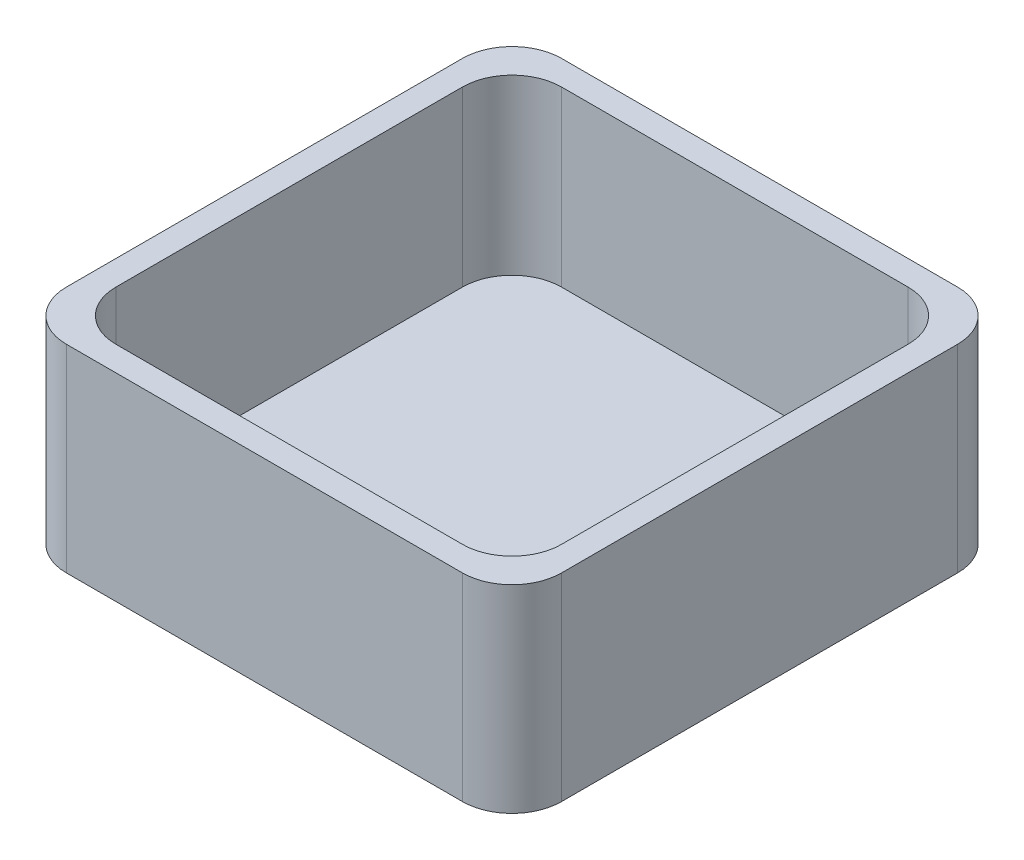
ISO-10303-21;
HEADER;
FILE_DESCRIPTION(('STEP AP214'),'2;1');
FILE_NAME('part.step','',(''),(''),'','','');
FILE_SCHEMA(('AUTOMOTIVE_DESIGN { 1 0 10303 214 1 1 1 1 }'));
ENDSEC;
DATA;
#1=APPLICATION_CONTEXT('core data for automotive mechanical design processes');
#2=APPLICATION_PROTOCOL_DEFINITION('international standard','automotive_design',2000,#1);
#3=PRODUCT_CONTEXT('',#1,'mechanical');
#4=PRODUCT('Part','Part','',(#3));
#5=PRODUCT_RELATED_PRODUCT_CATEGORY('part','',(#4));
#6=PRODUCT_DEFINITION_FORMATION('','',#4);
#7=PRODUCT_DEFINITION_CONTEXT('part definition',#1,'design');
#8=PRODUCT_DEFINITION('design','',#6,#7);
#9=PRODUCT_DEFINITION_SHAPE('','',#8);
#10=(LENGTH_UNIT() NAMED_UNIT(*) SI_UNIT(.MILLI.,.METRE.));
#11=(NAMED_UNIT(*) PLANE_ANGLE_UNIT() SI_UNIT($,.RADIAN.));
#12=(NAMED_UNIT(*) SI_UNIT($,.STERADIAN.) SOLID_ANGLE_UNIT());
#13=UNCERTAINTY_MEASURE_WITH_UNIT(LENGTH_MEASURE(1.E-05),#10,'distance_accuracy_value','');
#14=(GEOMETRIC_REPRESENTATION_CONTEXT(3) GLOBAL_UNCERTAINTY_ASSIGNED_CONTEXT((#13)) GLOBAL_UNIT_ASSIGNED_CONTEXT((#10,
#11,#12)) REPRESENTATION_CONTEXT('',''));
#15=CARTESIAN_POINT('',(0.,0.,0.));
#16=DIRECTION('',(0.,0.,1.));
#17=DIRECTION('',(1.,0.,0.));
#18=AXIS2_PLACEMENT_3D('',#15,#16,#17);
#19=CARTESIAN_POINT('',(0.,40.,0.));
#20=DIRECTION('',(1.,0.,0.));
#21=DIRECTION('',(0.,0.,-1.));
#22=AXIS2_PLACEMENT_3D('',#19,#20,#21);
#23=PLANE('',#22);
#24=DIRECTION('',(0.,0.,1.));
#25=VECTOR('',#24,1.);
#26=CARTESIAN_POINT('',(0.,0.,0.));
#27=LINE('',#26,#25);
#28=CARTESIAN_POINT('',(0.,0.,10.));
#29=VERTEX_POINT('',#28);
#30=CARTESIAN_POINT('',(0.,0.,90.));
#31=VERTEX_POINT('',#30);
#32=EDGE_CURVE('E210',#29,#31,#27,.T.);
#33=ORIENTED_EDGE('',*,*,#32,.T.);
#34=DIRECTION('',(0.,-1.,0.));
#35=VECTOR('',#34,1.);
#36=CARTESIAN_POINT('',(0.,40.,90.));
#37=LINE('',#36,#35);
#38=CARTESIAN_POINT('',(0.,40.,90.));
#39=VERTEX_POINT('',#38);
#40=EDGE_CURVE('E166',#31,#39,#37,.F.);
#41=ORIENTED_EDGE('',*,*,#40,.T.);
#42=DIRECTION('',(0.,0.,1.));
#43=VECTOR('',#42,1.);
#44=CARTESIAN_POINT('',(0.,40.,0.));
#45=LINE('',#44,#43);
#46=CARTESIAN_POINT('',(0.,40.,10.));
#47=VERTEX_POINT('',#46);
#48=EDGE_CURVE('E195',#47,#39,#45,.T.);
#49=ORIENTED_EDGE('',*,*,#48,.F.);
#50=DIRECTION('',(0.,-1.,0.));
#51=VECTOR('',#50,1.);
#52=CARTESIAN_POINT('',(0.,40.,10.));
#53=LINE('',#52,#51);
#54=EDGE_CURVE('E300',#47,#29,#53,.T.);
#55=ORIENTED_EDGE('',*,*,#54,.T.);
#56=EDGE_LOOP('',(#33,#41,#49,#55));
#57=FACE_BOUND('',#56,.T.);
#58=ADVANCED_FACE('F39',(#57),#23,.F.);
#59=CARTESIAN_POINT('',(0.,40.,100.));
#60=DIRECTION('',(0.,0.,-1.));
#61=DIRECTION('',(-1.,0.,0.));
#62=AXIS2_PLACEMENT_3D('',#59,#60,#61);
#63=PLANE('',#62);
#64=DIRECTION('',(1.,0.,0.));
#65=VECTOR('',#64,1.);
#66=CARTESIAN_POINT('',(0.,0.,100.));
#67=LINE('',#66,#65);
#68=CARTESIAN_POINT('',(10.,0.,100.));
#69=VERTEX_POINT('',#68);
#70=CARTESIAN_POINT('',(90.,0.,100.));
#71=VERTEX_POINT('',#70);
#72=EDGE_CURVE('E214',#69,#71,#67,.T.);
#73=ORIENTED_EDGE('',*,*,#72,.T.);
#74=DIRECTION('',(0.,-1.,0.));
#75=VECTOR('',#74,1.);
#76=CARTESIAN_POINT('',(90.,40.,100.));
#77=LINE('',#76,#75);
#78=CARTESIAN_POINT('',(90.,40.,100.));
#79=VERTEX_POINT('',#78);
#80=EDGE_CURVE('E55',#71,#79,#77,.F.);
#81=ORIENTED_EDGE('',*,*,#80,.T.);
#82=DIRECTION('',(1.,0.,0.));
#83=VECTOR('',#82,1.);
#84=CARTESIAN_POINT('',(0.,40.,100.));
#85=LINE('',#84,#83);
#86=CARTESIAN_POINT('',(10.,40.,100.));
#87=VERTEX_POINT('',#86);
#88=EDGE_CURVE('E198',#87,#79,#85,.T.);
#89=ORIENTED_EDGE('',*,*,#88,.F.);
#90=DIRECTION('',(0.,-1.,0.));
#91=VECTOR('',#90,1.);
#92=CARTESIAN_POINT('',(10.,40.,100.));
#93=LINE('',#92,#91);
#94=EDGE_CURVE('E280',#87,#69,#93,.T.);
#95=ORIENTED_EDGE('',*,*,#94,.T.);
#96=EDGE_LOOP('',(#73,#81,#89,#95));
#97=FACE_BOUND('',#96,.T.);
#98=ADVANCED_FACE('F355',(#97),#63,.F.);
#99=CARTESIAN_POINT('',(100.,40.,0.));
#100=DIRECTION('',(-1.,0.,0.));
#101=DIRECTION('',(0.,0.,1.));
#102=AXIS2_PLACEMENT_3D('',#99,#100,#101);
#103=PLANE('',#102);
#104=DIRECTION('',(0.,0.,-1.));
#105=VECTOR('',#104,1.);
#106=CARTESIAN_POINT('',(100.,0.,0.));
#107=LINE('',#106,#105);
#108=CARTESIAN_POINT('',(100.,0.,90.));
#109=VERTEX_POINT('',#108);
#110=CARTESIAN_POINT('',(100.,0.,10.));
#111=VERTEX_POINT('',#110);
#112=EDGE_CURVE('E217',#109,#111,#107,.T.);
#113=ORIENTED_EDGE('',*,*,#112,.T.);
#114=DIRECTION('',(0.,-1.,0.));
#115=VECTOR('',#114,1.);
#116=CARTESIAN_POINT('',(100.,40.,10.));
#117=LINE('',#116,#115);
#118=CARTESIAN_POINT('',(100.,40.,10.));
#119=VERTEX_POINT('',#118);
#120=EDGE_CURVE('E266',#111,#119,#117,.F.);
#121=ORIENTED_EDGE('',*,*,#120,.T.);
#122=DIRECTION('',(0.,0.,-1.));
#123=VECTOR('',#122,1.);
#124=CARTESIAN_POINT('',(100.,40.,0.));
#125=LINE('',#124,#123);
#126=CARTESIAN_POINT('',(100.,40.,90.));
#127=VERTEX_POINT('',#126);
#128=EDGE_CURVE('E202',#127,#119,#125,.T.);
#129=ORIENTED_EDGE('',*,*,#128,.F.);
#130=DIRECTION('',(0.,-1.,0.));
#131=VECTOR('',#130,1.);
#132=CARTESIAN_POINT('',(100.,40.,90.));
#133=LINE('',#132,#131);
#134=EDGE_CURVE('E262',#127,#109,#133,.T.);
#135=ORIENTED_EDGE('',*,*,#134,.T.);
#136=EDGE_LOOP('',(#113,#121,#129,#135));
#137=FACE_BOUND('',#136,.T.);
#138=ADVANCED_FACE('F361',(#137),#103,.F.);
#139=CARTESIAN_POINT('',(0.,40.,0.));
#140=DIRECTION('',(0.,0.,1.));
#141=DIRECTION('',(1.,0.,0.));
#142=AXIS2_PLACEMENT_3D('',#139,#140,#141);
#143=PLANE('',#142);
#144=DIRECTION('',(-1.,0.,0.));
#145=VECTOR('',#144,1.);
#146=CARTESIAN_POINT('',(0.,40.,0.));
#147=LINE('',#146,#145);
#148=CARTESIAN_POINT('',(90.,40.,0.));
#149=VERTEX_POINT('',#148);
#150=CARTESIAN_POINT('',(10.,40.,0.));
#151=VERTEX_POINT('',#150);
#152=EDGE_CURVE('E206',#149,#151,#147,.T.);
#153=ORIENTED_EDGE('',*,*,#152,.F.);
#154=DIRECTION('',(0.,-1.,0.));
#155=VECTOR('',#154,1.);
#156=CARTESIAN_POINT('',(90.,40.,0.));
#157=LINE('',#156,#155);
#158=CARTESIAN_POINT('',(90.,0.,0.));
#159=VERTEX_POINT('',#158);
#160=EDGE_CURVE('E246',#149,#159,#157,.T.);
#161=ORIENTED_EDGE('',*,*,#160,.T.);
#162=DIRECTION('',(-1.,0.,0.));
#163=VECTOR('',#162,1.);
#164=CARTESIAN_POINT('',(0.,0.,0.));
#165=LINE('',#164,#163);
#166=CARTESIAN_POINT('',(10.,0.,0.));
#167=VERTEX_POINT('',#166);
#168=EDGE_CURVE('E199',#159,#167,#165,.T.);
#169=ORIENTED_EDGE('',*,*,#168,.T.);
#170=DIRECTION('',(0.,-1.,0.));
#171=VECTOR('',#170,1.);
#172=CARTESIAN_POINT('',(10.,40.,0.));
#173=LINE('',#172,#171);
#174=EDGE_CURVE('E243',#167,#151,#173,.F.);
#175=ORIENTED_EDGE('',*,*,#174,.T.);
#176=EDGE_LOOP('',(#153,#161,#169,#175));
#177=FACE_BOUND('',#176,.T.);
#178=ADVANCED_FACE('F413',(#177),#143,.F.);
#179=CARTESIAN_POINT('',(0.,40.,0.));
#180=DIRECTION('',(0.,1.,0.));
#181=DIRECTION('',(0.,0.,1.));
#182=AXIS2_PLACEMENT_3D('',#179,#180,#181);
#183=PLANE('',#182);
#184=DIRECTION('',(0.,0.,1.));
#185=VECTOR('',#184,1.);
#186=CARTESIAN_POINT('',(5.,40.,5.));
#187=LINE('',#186,#185);
#188=CARTESIAN_POINT('',(5.,40.,15.));
#189=VERTEX_POINT('',#188);
#190=CARTESIAN_POINT('',(5.00000000000001,40.,85.));
#191=VERTEX_POINT('',#190);
#192=EDGE_CURVE('E310',#189,#191,#187,.T.);
#193=ORIENTED_EDGE('',*,*,#192,.F.);
#194=CARTESIAN_POINT('',(15.,40.,15.));
#195=DIRECTION('',(0.,1.,0.));
#196=DIRECTION('',(0.,0.,1.));
#197=AXIS2_PLACEMENT_3D('',#194,#195,#196);
#198=CIRCLE('',#197,10.);
#199=CARTESIAN_POINT('',(15.,40.,5.));
#200=VERTEX_POINT('',#199);
#201=EDGE_CURVE('E11',#189,#200,#198,.F.);
#202=ORIENTED_EDGE('',*,*,#201,.T.);
#203=DIRECTION('',(-1.,0.,0.));
#204=VECTOR('',#203,1.);
#205=CARTESIAN_POINT('',(5.,40.,5.));
#206=LINE('',#205,#204);
#207=CARTESIAN_POINT('',(85.,40.,5.));
#208=VERTEX_POINT('',#207);
#209=EDGE_CURVE('E172',#208,#200,#206,.T.);
#210=ORIENTED_EDGE('',*,*,#209,.F.);
#211=CARTESIAN_POINT('',(85.,40.,15.));
#212=DIRECTION('',(0.,1.,0.));
#213=DIRECTION('',(0.,0.,1.));
#214=AXIS2_PLACEMENT_3D('',#211,#212,#213);
#215=CIRCLE('',#214,10.);
#216=CARTESIAN_POINT('',(95.,40.,15.));
#217=VERTEX_POINT('',#216);
#218=EDGE_CURVE('E154',#208,#217,#215,.F.);
#219=ORIENTED_EDGE('',*,*,#218,.T.);
#220=DIRECTION('',(0.,0.,-1.));
#221=VECTOR('',#220,1.);
#222=CARTESIAN_POINT('',(95.,40.,5.));
#223=LINE('',#222,#221);
#224=CARTESIAN_POINT('',(95.,40.,85.));
#225=VERTEX_POINT('',#224);
#226=EDGE_CURVE('E184',#225,#217,#223,.T.);
#227=ORIENTED_EDGE('',*,*,#226,.F.);
#228=CARTESIAN_POINT('',(85.,40.,85.));
#229=DIRECTION('',(0.,1.,0.));
#230=DIRECTION('',(0.,0.,1.));
#231=AXIS2_PLACEMENT_3D('',#228,#229,#230);
#232=CIRCLE('',#231,10.);
#233=CARTESIAN_POINT('',(85.,40.,95.));
#234=VERTEX_POINT('',#233);
#235=EDGE_CURVE('E165',#225,#234,#232,.F.);
#236=ORIENTED_EDGE('',*,*,#235,.T.);
#237=DIRECTION('',(1.,0.,0.));
#238=VECTOR('',#237,1.);
#239=CARTESIAN_POINT('',(5.00000000000001,40.,95.));
#240=LINE('',#239,#238);
#241=CARTESIAN_POINT('',(15.,40.,95.));
#242=VERTEX_POINT('',#241);
#243=EDGE_CURVE('E191',#242,#234,#240,.T.);
#244=ORIENTED_EDGE('',*,*,#243,.F.);
#245=CARTESIAN_POINT('',(15.,40.,85.));
#246=DIRECTION('',(0.,1.,0.));
#247=DIRECTION('',(0.,0.,1.));
#248=AXIS2_PLACEMENT_3D('',#245,#246,#247);
#249=CIRCLE('',#248,10.);
#250=EDGE_CURVE('E48',#242,#191,#249,.F.);
#251=ORIENTED_EDGE('',*,*,#250,.T.);
#252=EDGE_LOOP('',(#193,#202,#210,#219,#227,#236,#244,#251));
#253=FACE_BOUND('',#252,.T.);
#254=ORIENTED_EDGE('',*,*,#128,.T.);
#255=CARTESIAN_POINT('',(90.,40.,10.));
#256=DIRECTION('',(0.,1.,0.));
#257=DIRECTION('',(0.,0.,1.));
#258=AXIS2_PLACEMENT_3D('',#255,#256,#257);
#259=CIRCLE('',#258,10.);
#260=EDGE_CURVE('E277',#119,#149,#259,.T.);
#261=ORIENTED_EDGE('',*,*,#260,.T.);
#262=ORIENTED_EDGE('',*,*,#152,.T.);
#263=CARTESIAN_POINT('',(10.,40.,10.));
#264=DIRECTION('',(0.,1.,0.));
#265=DIRECTION('',(0.,0.,1.));
#266=AXIS2_PLACEMENT_3D('',#263,#264,#265);
#267=CIRCLE('',#266,10.);
#268=EDGE_CURVE('E269',#151,#47,#267,.T.);
#269=ORIENTED_EDGE('',*,*,#268,.T.);
#270=ORIENTED_EDGE('',*,*,#48,.T.);
#271=CARTESIAN_POINT('',(10.,40.,90.));
#272=DIRECTION('',(0.,1.,0.));
#273=DIRECTION('',(0.,0.,1.));
#274=AXIS2_PLACEMENT_3D('',#271,#272,#273);
#275=CIRCLE('',#274,10.);
#276=EDGE_CURVE('E62',#39,#87,#275,.T.);
#277=ORIENTED_EDGE('',*,*,#276,.T.);
#278=ORIENTED_EDGE('',*,*,#88,.T.);
#279=CARTESIAN_POINT('',(90.,40.,90.));
#280=DIRECTION('',(0.,1.,0.));
#281=DIRECTION('',(0.,0.,1.));
#282=AXIS2_PLACEMENT_3D('',#279,#280,#281);
#283=CIRCLE('',#282,10.);
#284=EDGE_CURVE('E274',#79,#127,#283,.T.);
#285=ORIENTED_EDGE('',*,*,#284,.T.);
#286=EDGE_LOOP('',(#254,#261,#262,#269,#270,#277,#278,#285));
#287=FACE_BOUND('',#286,.T.);
#288=ADVANCED_FACE('F181',(#253,#287),#183,.T.);
#289=CARTESIAN_POINT('',(0.,0.,0.));
#290=DIRECTION('',(0.,1.,0.));
#291=DIRECTION('',(0.,0.,1.));
#292=AXIS2_PLACEMENT_3D('',#289,#290,#291);
#293=PLANE('',#292);
#294=ORIENTED_EDGE('',*,*,#168,.F.);
#295=CARTESIAN_POINT('',(90.,0.,10.));
#296=DIRECTION('',(0.,1.,0.));
#297=DIRECTION('',(0.,0.,1.));
#298=AXIS2_PLACEMENT_3D('',#295,#296,#297);
#299=CIRCLE('',#298,10.);
#300=EDGE_CURVE('E259',#159,#111,#299,.F.);
#301=ORIENTED_EDGE('',*,*,#300,.T.);
#302=ORIENTED_EDGE('',*,*,#112,.F.);
#303=CARTESIAN_POINT('',(90.,0.,90.));
#304=DIRECTION('',(0.,1.,0.));
#305=DIRECTION('',(0.,0.,1.));
#306=AXIS2_PLACEMENT_3D('',#303,#304,#305);
#307=CIRCLE('',#306,10.);
#308=EDGE_CURVE('E256',#109,#71,#307,.F.);
#309=ORIENTED_EDGE('',*,*,#308,.T.);
#310=ORIENTED_EDGE('',*,*,#72,.F.);
#311=CARTESIAN_POINT('',(10.,0.,90.));
#312=DIRECTION('',(0.,1.,0.));
#313=DIRECTION('',(0.,0.,1.));
#314=AXIS2_PLACEMENT_3D('',#311,#312,#313);
#315=CIRCLE('',#314,10.);
#316=EDGE_CURVE('E253',#69,#31,#315,.F.);
#317=ORIENTED_EDGE('',*,*,#316,.T.);
#318=ORIENTED_EDGE('',*,*,#32,.F.);
#319=CARTESIAN_POINT('',(10.,0.,10.));
#320=DIRECTION('',(0.,1.,0.));
#321=DIRECTION('',(0.,0.,1.));
#322=AXIS2_PLACEMENT_3D('',#319,#320,#321);
#323=CIRCLE('',#322,10.);
#324=EDGE_CURVE('E250',#29,#167,#323,.F.);
#325=ORIENTED_EDGE('',*,*,#324,.T.);
#326=EDGE_LOOP('',(#294,#301,#302,#309,#310,#317,#318,#325));
#327=FACE_BOUND('',#326,.T.);
#328=ADVANCED_FACE('F403',(#327),#293,.F.);
#329=CARTESIAN_POINT('',(5.,5.,5.));
#330=DIRECTION('',(-1.,0.,0.));
#331=DIRECTION('',(0.,0.,1.));
#332=AXIS2_PLACEMENT_3D('',#329,#330,#331);
#333=PLANE('',#332);
#334=ORIENTED_EDGE('',*,*,#192,.T.);
#335=DIRECTION('',(0.,1.,0.));
#336=VECTOR('',#335,1.);
#337=CARTESIAN_POINT('',(5.00000000000001,5.,85.));
#338=LINE('',#337,#336);
#339=CARTESIAN_POINT('',(5.00000000000001,5.,85.));
#340=VERTEX_POINT('',#339);
#341=EDGE_CURVE('E297',#191,#340,#338,.F.);
#342=ORIENTED_EDGE('',*,*,#341,.T.);
#343=DIRECTION('',(0.,0.,1.));
#344=VECTOR('',#343,1.);
#345=CARTESIAN_POINT('',(5.,5.,5.));
#346=LINE('',#345,#344);
#347=CARTESIAN_POINT('',(5.,5.,15.));
#348=VERTEX_POINT('',#347);
#349=EDGE_CURVE('E183',#348,#340,#346,.T.);
#350=ORIENTED_EDGE('',*,*,#349,.F.);
#351=DIRECTION('',(0.,1.,0.));
#352=VECTOR('',#351,1.);
#353=CARTESIAN_POINT('',(5.,40.,15.));
#354=LINE('',#353,#352);
#355=EDGE_CURVE('E293',#348,#189,#354,.T.);
#356=ORIENTED_EDGE('',*,*,#355,.T.);
#357=EDGE_LOOP('',(#334,#342,#350,#356));
#358=FACE_BOUND('',#357,.T.);
#359=ADVANCED_FACE('F316',(#358),#333,.F.);
#360=CARTESIAN_POINT('',(5.,5.,5.));
#361=DIRECTION('',(0.,0.,-1.));
#362=DIRECTION('',(-1.,0.,0.));
#363=AXIS2_PLACEMENT_3D('',#360,#361,#362);
#364=PLANE('',#363);
#365=DIRECTION('',(-1.,0.,0.));
#366=VECTOR('',#365,1.);
#367=CARTESIAN_POINT('',(5.,5.,5.));
#368=LINE('',#367,#366);
#369=CARTESIAN_POINT('',(85.,5.,5.));
#370=VERTEX_POINT('',#369);
#371=CARTESIAN_POINT('',(15.,5.,5.));
#372=VERTEX_POINT('',#371);
#373=EDGE_CURVE('E175',#370,#372,#368,.T.);
#374=ORIENTED_EDGE('',*,*,#373,.F.);
#375=DIRECTION('',(0.,1.,0.));
#376=VECTOR('',#375,1.);
#377=CARTESIAN_POINT('',(85.,40.,5.));
#378=LINE('',#377,#376);
#379=EDGE_CURVE('E158',#370,#208,#378,.T.);
#380=ORIENTED_EDGE('',*,*,#379,.T.);
#381=ORIENTED_EDGE('',*,*,#209,.T.);
#382=DIRECTION('',(0.,1.,0.));
#383=VECTOR('',#382,1.);
#384=CARTESIAN_POINT('',(15.,5.,5.));
#385=LINE('',#384,#383);
#386=EDGE_CURVE('E178',#200,#372,#385,.F.);
#387=ORIENTED_EDGE('',*,*,#386,.T.);
#388=EDGE_LOOP('',(#374,#380,#381,#387));
#389=FACE_BOUND('',#388,.T.);
#390=ADVANCED_FACE('F171',(#389),#364,.F.);
#391=CARTESIAN_POINT('',(95.,5.,5.));
#392=DIRECTION('',(1.,0.,0.));
#393=DIRECTION('',(0.,0.,-1.));
#394=AXIS2_PLACEMENT_3D('',#391,#392,#393);
#395=PLANE('',#394);
#396=ORIENTED_EDGE('',*,*,#226,.T.);
#397=DIRECTION('',(0.,1.,0.));
#398=VECTOR('',#397,1.);
#399=CARTESIAN_POINT('',(95.,5.,15.));
#400=LINE('',#399,#398);
#401=CARTESIAN_POINT('',(95.,5.,15.));
#402=VERTEX_POINT('',#401);
#403=EDGE_CURVE('E159',#217,#402,#400,.F.);
#404=ORIENTED_EDGE('',*,*,#403,.T.);
#405=DIRECTION('',(0.,0.,-1.));
#406=VECTOR('',#405,1.);
#407=CARTESIAN_POINT('',(95.,5.,5.));
#408=LINE('',#407,#406);
#409=CARTESIAN_POINT('',(95.,5.,85.));
#410=VERTEX_POINT('',#409);
#411=EDGE_CURVE('E333',#410,#402,#408,.T.);
#412=ORIENTED_EDGE('',*,*,#411,.F.);
#413=DIRECTION('',(0.,1.,0.));
#414=VECTOR('',#413,1.);
#415=CARTESIAN_POINT('',(95.,40.,85.));
#416=LINE('',#415,#414);
#417=EDGE_CURVE('E177',#410,#225,#416,.T.);
#418=ORIENTED_EDGE('',*,*,#417,.T.);
#419=EDGE_LOOP('',(#396,#404,#412,#418));
#420=FACE_BOUND('',#419,.T.);
#421=ADVANCED_FACE('F345',(#420),#395,.F.);
#422=CARTESIAN_POINT('',(5.00000000000001,5.,95.));
#423=DIRECTION('',(0.,0.,1.));
#424=DIRECTION('',(1.,0.,0.));
#425=AXIS2_PLACEMENT_3D('',#422,#423,#424);
#426=PLANE('',#425);
#427=ORIENTED_EDGE('',*,*,#243,.T.);
#428=DIRECTION('',(0.,1.,0.));
#429=VECTOR('',#428,1.);
#430=CARTESIAN_POINT('',(85.,5.,95.));
#431=LINE('',#430,#429);
#432=CARTESIAN_POINT('',(85.,5.,95.));
#433=VERTEX_POINT('',#432);
#434=EDGE_CURVE('E290',#234,#433,#431,.F.);
#435=ORIENTED_EDGE('',*,*,#434,.T.);
#436=DIRECTION('',(1.,0.,0.));
#437=VECTOR('',#436,1.);
#438=CARTESIAN_POINT('',(5.00000000000001,5.,95.));
#439=LINE('',#438,#437);
#440=CARTESIAN_POINT('',(15.,5.,95.));
#441=VERTEX_POINT('',#440);
#442=EDGE_CURVE('E189',#441,#433,#439,.T.);
#443=ORIENTED_EDGE('',*,*,#442,.F.);
#444=DIRECTION('',(0.,1.,0.));
#445=VECTOR('',#444,1.);
#446=CARTESIAN_POINT('',(15.,40.,95.));
#447=LINE('',#446,#445);
#448=EDGE_CURVE('E286',#441,#242,#447,.T.);
#449=ORIENTED_EDGE('',*,*,#448,.T.);
#450=EDGE_LOOP('',(#427,#435,#443,#449));
#451=FACE_BOUND('',#450,.T.);
#452=ADVANCED_FACE('F330',(#451),#426,.F.);
#453=CARTESIAN_POINT('',(0.,5.,0.));
#454=DIRECTION('',(0.,1.,0.));
#455=DIRECTION('',(0.,0.,1.));
#456=AXIS2_PLACEMENT_3D('',#453,#454,#455);
#457=PLANE('',#456);
#458=ORIENTED_EDGE('',*,*,#411,.T.);
#459=CARTESIAN_POINT('',(85.,5.,15.));
#460=DIRECTION('',(0.,1.,0.));
#461=DIRECTION('',(0.,0.,1.));
#462=AXIS2_PLACEMENT_3D('',#459,#460,#461);
#463=CIRCLE('',#462,10.);
#464=EDGE_CURVE('E240',#402,#370,#463,.T.);
#465=ORIENTED_EDGE('',*,*,#464,.T.);
#466=ORIENTED_EDGE('',*,*,#373,.T.);
#467=CARTESIAN_POINT('',(15.,5.,15.));
#468=DIRECTION('',(0.,1.,0.));
#469=DIRECTION('',(0.,0.,1.));
#470=AXIS2_PLACEMENT_3D('',#467,#468,#469);
#471=CIRCLE('',#470,10.);
#472=EDGE_CURVE('E231',#372,#348,#471,.T.);
#473=ORIENTED_EDGE('',*,*,#472,.T.);
#474=ORIENTED_EDGE('',*,*,#349,.T.);
#475=CARTESIAN_POINT('',(15.,5.,85.));
#476=DIRECTION('',(0.,1.,0.));
#477=DIRECTION('',(0.,0.,1.));
#478=AXIS2_PLACEMENT_3D('',#475,#476,#477);
#479=CIRCLE('',#478,10.);
#480=EDGE_CURVE('E234',#340,#441,#479,.T.);
#481=ORIENTED_EDGE('',*,*,#480,.T.);
#482=ORIENTED_EDGE('',*,*,#442,.T.);
#483=CARTESIAN_POINT('',(85.,5.,85.));
#484=DIRECTION('',(0.,1.,0.));
#485=DIRECTION('',(0.,0.,1.));
#486=AXIS2_PLACEMENT_3D('',#483,#484,#485);
#487=CIRCLE('',#486,10.);
#488=EDGE_CURVE('E237',#433,#410,#487,.T.);
#489=ORIENTED_EDGE('',*,*,#488,.T.);
#490=EDGE_LOOP('',(#458,#465,#466,#473,#474,#481,#482,#489));
#491=FACE_BOUND('',#490,.T.);
#492=ADVANCED_FACE('F327',(#491),#457,.T.);
#493=CARTESIAN_POINT('',(85.,5.,15.));
#494=DIRECTION('',(0.,-1.,0.));
#495=DIRECTION('',(0.,0.,-1.));
#496=AXIS2_PLACEMENT_3D('',#493,#494,#495);
#497=CYLINDRICAL_SURFACE('',#496,10.);
#498=ORIENTED_EDGE('',*,*,#464,.F.);
#499=ORIENTED_EDGE('',*,*,#403,.F.);
#500=ORIENTED_EDGE('',*,*,#218,.F.);
#501=ORIENTED_EDGE('',*,*,#379,.F.);
#502=EDGE_LOOP('',(#498,#499,#500,#501));
#503=FACE_BOUND('',#502,.T.);
#504=ADVANCED_FACE('F157',(#503),#497,.F.);
#505=CARTESIAN_POINT('',(90.,40.,10.));
#506=DIRECTION('',(0.,-1.,0.));
#507=DIRECTION('',(0.,0.,-1.));
#508=AXIS2_PLACEMENT_3D('',#505,#506,#507);
#509=CYLINDRICAL_SURFACE('',#508,10.);
#510=ORIENTED_EDGE('',*,*,#260,.F.);
#511=ORIENTED_EDGE('',*,*,#120,.F.);
#512=ORIENTED_EDGE('',*,*,#300,.F.);
#513=ORIENTED_EDGE('',*,*,#160,.F.);
#514=EDGE_LOOP('',(#510,#511,#512,#513));
#515=FACE_BOUND('',#514,.T.);
#516=ADVANCED_FACE('F367',(#515),#509,.T.);
#517=CARTESIAN_POINT('',(90.,40.,90.));
#518=DIRECTION('',(0.,-1.,0.));
#519=DIRECTION('',(0.,0.,-1.));
#520=AXIS2_PLACEMENT_3D('',#517,#518,#519);
#521=CYLINDRICAL_SURFACE('',#520,10.);
#522=ORIENTED_EDGE('',*,*,#284,.F.);
#523=ORIENTED_EDGE('',*,*,#80,.F.);
#524=ORIENTED_EDGE('',*,*,#308,.F.);
#525=ORIENTED_EDGE('',*,*,#134,.F.);
#526=EDGE_LOOP('',(#522,#523,#524,#525));
#527=FACE_BOUND('',#526,.T.);
#528=ADVANCED_FACE('F370',(#527),#521,.T.);
#529=CARTESIAN_POINT('',(85.,5.,85.));
#530=DIRECTION('',(0.,-1.,0.));
#531=DIRECTION('',(0.,0.,-1.));
#532=AXIS2_PLACEMENT_3D('',#529,#530,#531);
#533=CYLINDRICAL_SURFACE('',#532,10.);
#534=ORIENTED_EDGE('',*,*,#488,.F.);
#535=ORIENTED_EDGE('',*,*,#434,.F.);
#536=ORIENTED_EDGE('',*,*,#235,.F.);
#537=ORIENTED_EDGE('',*,*,#417,.F.);
#538=EDGE_LOOP('',(#534,#535,#536,#537));
#539=FACE_BOUND('',#538,.T.);
#540=ADVANCED_FACE('F341',(#539),#533,.F.);
#541=CARTESIAN_POINT('',(15.,5.,85.));
#542=DIRECTION('',(0.,-1.,0.));
#543=DIRECTION('',(0.,0.,-1.));
#544=AXIS2_PLACEMENT_3D('',#541,#542,#543);
#545=CYLINDRICAL_SURFACE('',#544,10.);
#546=ORIENTED_EDGE('',*,*,#480,.F.);
#547=ORIENTED_EDGE('',*,*,#341,.F.);
#548=ORIENTED_EDGE('',*,*,#250,.F.);
#549=ORIENTED_EDGE('',*,*,#448,.F.);
#550=EDGE_LOOP('',(#546,#547,#548,#549));
#551=FACE_BOUND('',#550,.T.);
#552=ADVANCED_FACE('F322',(#551),#545,.F.);
#553=CARTESIAN_POINT('',(10.,40.,90.));
#554=DIRECTION('',(0.,-1.,0.));
#555=DIRECTION('',(0.,0.,-1.));
#556=AXIS2_PLACEMENT_3D('',#553,#554,#555);
#557=CYLINDRICAL_SURFACE('',#556,10.);
#558=ORIENTED_EDGE('',*,*,#276,.F.);
#559=ORIENTED_EDGE('',*,*,#40,.F.);
#560=ORIENTED_EDGE('',*,*,#316,.F.);
#561=ORIENTED_EDGE('',*,*,#94,.F.);
#562=EDGE_LOOP('',(#558,#559,#560,#561));
#563=FACE_BOUND('',#562,.T.);
#564=ADVANCED_FACE('F379',(#563),#557,.T.);
#565=CARTESIAN_POINT('',(15.,5.,15.));
#566=DIRECTION('',(0.,-1.,0.));
#567=DIRECTION('',(0.,0.,-1.));
#568=AXIS2_PLACEMENT_3D('',#565,#566,#567);
#569=CYLINDRICAL_SURFACE('',#568,10.);
#570=ORIENTED_EDGE('',*,*,#472,.F.);
#571=ORIENTED_EDGE('',*,*,#386,.F.);
#572=ORIENTED_EDGE('',*,*,#201,.F.);
#573=ORIENTED_EDGE('',*,*,#355,.F.);
#574=EDGE_LOOP('',(#570,#571,#572,#573));
#575=FACE_BOUND('',#574,.T.);
#576=ADVANCED_FACE('F381',(#575),#569,.F.);
#577=CARTESIAN_POINT('',(10.,40.,10.));
#578=DIRECTION('',(0.,-1.,0.));
#579=DIRECTION('',(0.,0.,-1.));
#580=AXIS2_PLACEMENT_3D('',#577,#578,#579);
#581=CYLINDRICAL_SURFACE('',#580,10.);
#582=ORIENTED_EDGE('',*,*,#268,.F.);
#583=ORIENTED_EDGE('',*,*,#174,.F.);
#584=ORIENTED_EDGE('',*,*,#324,.F.);
#585=ORIENTED_EDGE('',*,*,#54,.F.);
#586=EDGE_LOOP('',(#582,#583,#584,#585));
#587=FACE_BOUND('',#586,.T.);
#588=ADVANCED_FACE('F41',(#587),#581,.T.);
#589=CLOSED_SHELL('',(#58,#98,#138,#178,#288,#328,#359,#390,#421,#452,#492,#504,#516,#528,#540,
#552,#564,#576,#588));
#590=MANIFOLD_SOLID_BREP('B2',#589);
#591=ADVANCED_BREP_SHAPE_REPRESENTATION('',(#18,#590),#14);
#592=SHAPE_DEFINITION_REPRESENTATION(#9,#591);
ENDSEC;
END-ISO-10303-21;
